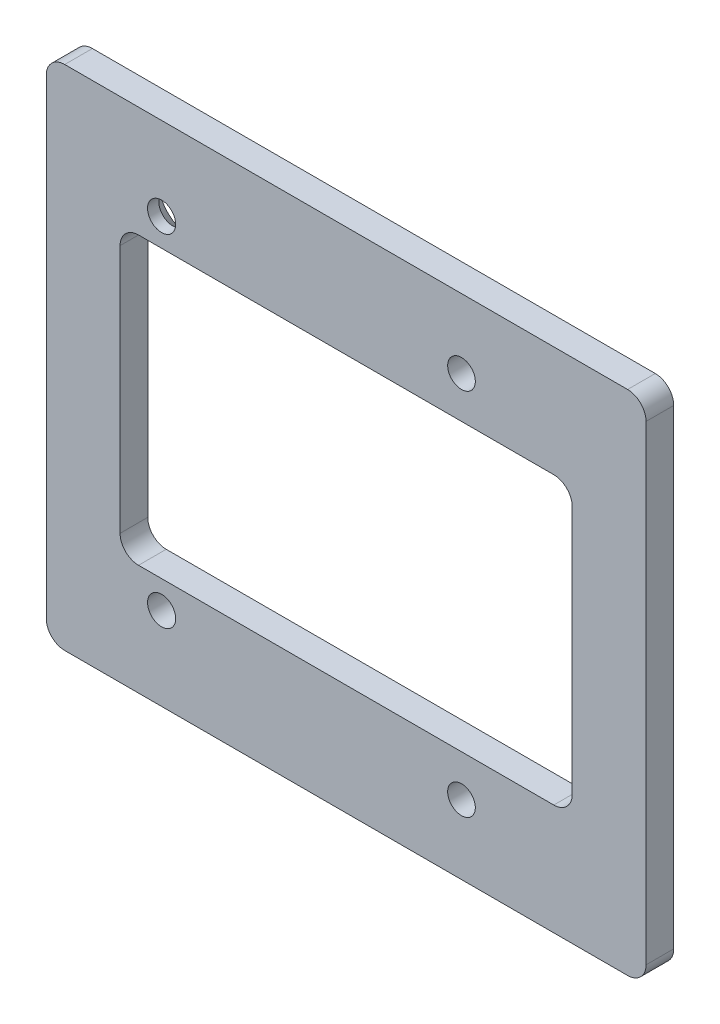
ISO-10303-21;
HEADER;
FILE_DESCRIPTION(('STEP AP214'),'2;1');
FILE_NAME('part.step','',(''),(''),'','','');
FILE_SCHEMA(('AUTOMOTIVE_DESIGN { 1 0 10303 214 1 1 1 1 }'));
ENDSEC;
DATA;
#1=APPLICATION_CONTEXT('core data for automotive mechanical design processes');
#2=APPLICATION_PROTOCOL_DEFINITION('international standard','automotive_design',2000,#1);
#3=PRODUCT_CONTEXT('',#1,'mechanical');
#4=PRODUCT('Part','Part','',(#3));
#5=PRODUCT_RELATED_PRODUCT_CATEGORY('part','',(#4));
#6=PRODUCT_DEFINITION_FORMATION('','',#4);
#7=PRODUCT_DEFINITION_CONTEXT('part definition',#1,'design');
#8=PRODUCT_DEFINITION('design','',#6,#7);
#9=PRODUCT_DEFINITION_SHAPE('','',#8);
#10=(LENGTH_UNIT() NAMED_UNIT(*) SI_UNIT(.MILLI.,.METRE.));
#11=(NAMED_UNIT(*) PLANE_ANGLE_UNIT() SI_UNIT($,.RADIAN.));
#12=(NAMED_UNIT(*) SI_UNIT($,.STERADIAN.) SOLID_ANGLE_UNIT());
#13=UNCERTAINTY_MEASURE_WITH_UNIT(LENGTH_MEASURE(1.E-05),#10,'distance_accuracy_value','');
#14=(GEOMETRIC_REPRESENTATION_CONTEXT(3) GLOBAL_UNCERTAINTY_ASSIGNED_CONTEXT((#13)) GLOBAL_UNIT_ASSIGNED_CONTEXT((#10,
#11,#12)) REPRESENTATION_CONTEXT('',''));
#15=CARTESIAN_POINT('',(0.,0.,0.));
#16=DIRECTION('',(0.,0.,1.));
#17=DIRECTION('',(1.,0.,0.));
#18=AXIS2_PLACEMENT_3D('',#15,#16,#17);
#19=CARTESIAN_POINT('',(32.5,-27.5,3.));
#20=DIRECTION('',(-1.,0.,0.));
#21=DIRECTION('',(0.,0.,1.));
#22=AXIS2_PLACEMENT_3D('',#19,#20,#21);
#23=PLANE('',#22);
#24=DIRECTION('',(0.,1.,0.));
#25=VECTOR('',#24,1.);
#26=CARTESIAN_POINT('',(32.5,-27.5,3.));
#27=LINE('',#26,#25);
#28=CARTESIAN_POINT('',(32.5,-25.5,3.));
#29=VERTEX_POINT('',#28);
#30=CARTESIAN_POINT('',(32.5,25.5,3.));
#31=VERTEX_POINT('',#30);
#32=EDGE_CURVE('E197',#29,#31,#27,.T.);
#33=ORIENTED_EDGE('',*,*,#32,.F.);
#34=DIRECTION('',(0.,0.,-1.));
#35=VECTOR('',#34,1.);
#36=CARTESIAN_POINT('',(32.5,-25.5,3.));
#37=LINE('',#36,#35);
#38=CARTESIAN_POINT('',(32.5,-25.5,0.));
#39=VERTEX_POINT('',#38);
#40=EDGE_CURVE('E222',#29,#39,#37,.T.);
#41=ORIENTED_EDGE('',*,*,#40,.T.);
#42=DIRECTION('',(0.,1.,0.));
#43=VECTOR('',#42,1.);
#44=CARTESIAN_POINT('',(32.5,-27.5,0.));
#45=LINE('',#44,#43);
#46=CARTESIAN_POINT('',(32.5,25.5,0.));
#47=VERTEX_POINT('',#46);
#48=EDGE_CURVE('E196',#39,#47,#45,.T.);
#49=ORIENTED_EDGE('',*,*,#48,.T.);
#50=DIRECTION('',(0.,0.,-1.));
#51=VECTOR('',#50,1.);
#52=CARTESIAN_POINT('',(32.5,25.5,3.));
#53=LINE('',#52,#51);
#54=EDGE_CURVE('E210',#47,#31,#53,.F.);
#55=ORIENTED_EDGE('',*,*,#54,.T.);
#56=EDGE_LOOP('',(#33,#41,#49,#55));
#57=FACE_BOUND('',#56,.T.);
#58=ADVANCED_FACE('F34',(#57),#23,.F.);
#59=CARTESIAN_POINT('',(-32.5,27.5,3.));
#60=DIRECTION('',(0.,-1.,0.));
#61=DIRECTION('',(0.,0.,-1.));
#62=AXIS2_PLACEMENT_3D('',#59,#60,#61);
#63=PLANE('',#62);
#64=DIRECTION('',(-1.,0.,0.));
#65=VECTOR('',#64,1.);
#66=CARTESIAN_POINT('',(-32.5,27.5,0.));
#67=LINE('',#66,#65);
#68=CARTESIAN_POINT('',(30.5,27.5,0.));
#69=VERTEX_POINT('',#68);
#70=CARTESIAN_POINT('',(-30.5,27.5,0.));
#71=VERTEX_POINT('',#70);
#72=EDGE_CURVE('E213',#69,#71,#67,.T.);
#73=ORIENTED_EDGE('',*,*,#72,.T.);
#74=DIRECTION('',(0.,0.,-1.));
#75=VECTOR('',#74,1.);
#76=CARTESIAN_POINT('',(-30.5,27.5,3.));
#77=LINE('',#76,#75);
#78=CARTESIAN_POINT('',(-30.5,27.5,3.));
#79=VERTEX_POINT('',#78);
#80=EDGE_CURVE('E166',#71,#79,#77,.F.);
#81=ORIENTED_EDGE('',*,*,#80,.T.);
#82=DIRECTION('',(-1.,0.,0.));
#83=VECTOR('',#82,1.);
#84=CARTESIAN_POINT('',(-32.5,27.5,3.));
#85=LINE('',#84,#83);
#86=CARTESIAN_POINT('',(30.5,27.5,3.));
#87=VERTEX_POINT('',#86);
#88=EDGE_CURVE('E200',#87,#79,#85,.T.);
#89=ORIENTED_EDGE('',*,*,#88,.F.);
#90=DIRECTION('',(0.,0.,-1.));
#91=VECTOR('',#90,1.);
#92=CARTESIAN_POINT('',(30.5,27.5,3.));
#93=LINE('',#92,#91);
#94=EDGE_CURVE('E251',#87,#69,#93,.T.);
#95=ORIENTED_EDGE('',*,*,#94,.T.);
#96=EDGE_LOOP('',(#73,#81,#89,#95));
#97=FACE_BOUND('',#96,.T.);
#98=ADVANCED_FACE('F290',(#97),#63,.F.);
#99=CARTESIAN_POINT('',(-32.5,-27.5,3.));
#100=DIRECTION('',(1.,0.,0.));
#101=DIRECTION('',(0.,0.,-1.));
#102=AXIS2_PLACEMENT_3D('',#99,#100,#101);
#103=PLANE('',#102);
#104=DIRECTION('',(0.,-1.,0.));
#105=VECTOR('',#104,1.);
#106=CARTESIAN_POINT('',(-32.5,-27.5,0.));
#107=LINE('',#106,#105);
#108=CARTESIAN_POINT('',(-32.5,25.5,0.));
#109=VERTEX_POINT('',#108);
#110=CARTESIAN_POINT('',(-32.5,-25.5,0.));
#111=VERTEX_POINT('',#110);
#112=EDGE_CURVE('E216',#109,#111,#107,.T.);
#113=ORIENTED_EDGE('',*,*,#112,.T.);
#114=DIRECTION('',(0.,0.,-1.));
#115=VECTOR('',#114,1.);
#116=CARTESIAN_POINT('',(-32.5,-25.5,3.));
#117=LINE('',#116,#115);
#118=CARTESIAN_POINT('',(-32.5,-25.5,3.));
#119=VERTEX_POINT('',#118);
#120=EDGE_CURVE('E249',#111,#119,#117,.F.);
#121=ORIENTED_EDGE('',*,*,#120,.T.);
#122=DIRECTION('',(0.,-1.,0.));
#123=VECTOR('',#122,1.);
#124=CARTESIAN_POINT('',(-32.5,-27.5,3.));
#125=LINE('',#124,#123);
#126=CARTESIAN_POINT('',(-32.5,25.5,3.));
#127=VERTEX_POINT('',#126);
#128=EDGE_CURVE('E204',#127,#119,#125,.T.);
#129=ORIENTED_EDGE('',*,*,#128,.F.);
#130=DIRECTION('',(0.,0.,-1.));
#131=VECTOR('',#130,1.);
#132=CARTESIAN_POINT('',(-32.5,25.5,3.));
#133=LINE('',#132,#131);
#134=EDGE_CURVE('E246',#127,#109,#133,.T.);
#135=ORIENTED_EDGE('',*,*,#134,.T.);
#136=EDGE_LOOP('',(#113,#121,#129,#135));
#137=FACE_BOUND('',#136,.T.);
#138=ADVANCED_FACE('F296',(#137),#103,.F.);
#139=CARTESIAN_POINT('',(-32.5,-27.5,3.));
#140=DIRECTION('',(0.,1.,0.));
#141=DIRECTION('',(0.,0.,1.));
#142=AXIS2_PLACEMENT_3D('',#139,#140,#141);
#143=PLANE('',#142);
#144=DIRECTION('',(1.,0.,0.));
#145=VECTOR('',#144,1.);
#146=CARTESIAN_POINT('',(-32.5,-27.5,0.));
#147=LINE('',#146,#145);
#148=CARTESIAN_POINT('',(-30.5,-27.5,0.));
#149=VERTEX_POINT('',#148);
#150=CARTESIAN_POINT('',(30.5,-27.5,0.));
#151=VERTEX_POINT('',#150);
#152=EDGE_CURVE('E201',#149,#151,#147,.T.);
#153=ORIENTED_EDGE('',*,*,#152,.T.);
#154=DIRECTION('',(0.,0.,-1.));
#155=VECTOR('',#154,1.);
#156=CARTESIAN_POINT('',(30.5,-27.5,3.));
#157=LINE('',#156,#155);
#158=CARTESIAN_POINT('',(30.5,-27.5,3.));
#159=VERTEX_POINT('',#158);
#160=EDGE_CURVE('E236',#151,#159,#157,.F.);
#161=ORIENTED_EDGE('',*,*,#160,.T.);
#162=DIRECTION('',(1.,0.,0.));
#163=VECTOR('',#162,1.);
#164=CARTESIAN_POINT('',(-32.5,-27.5,3.));
#165=LINE('',#164,#163);
#166=CARTESIAN_POINT('',(-30.5,-27.5,3.));
#167=VERTEX_POINT('',#166);
#168=EDGE_CURVE('E207',#167,#159,#165,.T.);
#169=ORIENTED_EDGE('',*,*,#168,.F.);
#170=DIRECTION('',(0.,0.,-1.));
#171=VECTOR('',#170,1.);
#172=CARTESIAN_POINT('',(-30.5,-27.5,3.));
#173=LINE('',#172,#171);
#174=EDGE_CURVE('E233',#167,#149,#173,.T.);
#175=ORIENTED_EDGE('',*,*,#174,.T.);
#176=EDGE_LOOP('',(#153,#161,#169,#175));
#177=FACE_BOUND('',#176,.T.);
#178=ADVANCED_FACE('F398',(#177),#143,.F.);
#179=CARTESIAN_POINT('',(0.,0.,3.));
#180=DIRECTION('',(0.,0.,-1.));
#181=DIRECTION('',(-1.,0.,0.));
#182=AXIS2_PLACEMENT_3D('',#179,#180,#181);
#183=PLANE('',#182);
#184=DIRECTION('',(0.,-1.,0.));
#185=VECTOR('',#184,1.);
#186=CARTESIAN_POINT('',(24.5,0.,3.));
#187=LINE('',#186,#185);
#188=CARTESIAN_POINT('',(24.5,13.5,3.));
#189=VERTEX_POINT('',#188);
#190=CARTESIAN_POINT('',(24.5,-13.5,3.));
#191=VERTEX_POINT('',#190);
#192=EDGE_CURVE('E387',#189,#191,#187,.T.);
#193=ORIENTED_EDGE('',*,*,#192,.T.);
#194=CARTESIAN_POINT('',(22.5,-13.5,3.));
#195=DIRECTION('',(0.,0.,-1.));
#196=DIRECTION('',(-1.,0.,0.));
#197=AXIS2_PLACEMENT_3D('',#194,#195,#196);
#198=CIRCLE('',#197,2.);
#199=CARTESIAN_POINT('',(22.5,-15.5,3.));
#200=VERTEX_POINT('',#199);
#201=EDGE_CURVE('E334',#191,#200,#198,.T.);
#202=ORIENTED_EDGE('',*,*,#201,.T.);
#203=DIRECTION('',(-1.,0.,0.));
#204=VECTOR('',#203,1.);
#205=CARTESIAN_POINT('',(0.,-15.5,3.));
#206=LINE('',#205,#204);
#207=CARTESIAN_POINT('',(-22.5,-15.5,3.));
#208=VERTEX_POINT('',#207);
#209=EDGE_CURVE('E375',#200,#208,#206,.T.);
#210=ORIENTED_EDGE('',*,*,#209,.T.);
#211=CARTESIAN_POINT('',(-22.5,-13.5,3.));
#212=DIRECTION('',(0.,0.,-1.));
#213=DIRECTION('',(-1.,0.,0.));
#214=AXIS2_PLACEMENT_3D('',#211,#212,#213);
#215=CIRCLE('',#214,2.);
#216=CARTESIAN_POINT('',(-24.5,-13.5,3.));
#217=VERTEX_POINT('',#216);
#218=EDGE_CURVE('E347',#208,#217,#215,.T.);
#219=ORIENTED_EDGE('',*,*,#218,.T.);
#220=DIRECTION('',(0.,1.,0.));
#221=VECTOR('',#220,1.);
#222=CARTESIAN_POINT('',(-24.5,0.,3.));
#223=LINE('',#222,#221);
#224=CARTESIAN_POINT('',(-24.5,13.5,3.));
#225=VERTEX_POINT('',#224);
#226=EDGE_CURVE('E369',#217,#225,#223,.T.);
#227=ORIENTED_EDGE('',*,*,#226,.T.);
#228=CARTESIAN_POINT('',(-22.5,13.5,3.));
#229=DIRECTION('',(0.,0.,-1.));
#230=DIRECTION('',(-1.,0.,0.));
#231=AXIS2_PLACEMENT_3D('',#228,#229,#230);
#232=CIRCLE('',#231,2.);
#233=CARTESIAN_POINT('',(-22.5,15.5,3.));
#234=VERTEX_POINT('',#233);
#235=EDGE_CURVE('E341',#225,#234,#232,.T.);
#236=ORIENTED_EDGE('',*,*,#235,.T.);
#237=DIRECTION('',(1.,0.,0.));
#238=VECTOR('',#237,1.);
#239=CARTESIAN_POINT('',(0.,15.5,3.));
#240=LINE('',#239,#238);
#241=CARTESIAN_POINT('',(22.5,15.5,3.));
#242=VERTEX_POINT('',#241);
#243=EDGE_CURVE('E378',#234,#242,#240,.T.);
#244=ORIENTED_EDGE('',*,*,#243,.T.);
#245=CARTESIAN_POINT('',(22.5,13.5,3.));
#246=DIRECTION('',(0.,0.,-1.));
#247=DIRECTION('',(-1.,0.,0.));
#248=AXIS2_PLACEMENT_3D('',#245,#246,#247);
#249=CIRCLE('',#248,2.);
#250=EDGE_CURVE('E11',#242,#189,#249,.T.);
#251=ORIENTED_EDGE('',*,*,#250,.T.);
#252=EDGE_LOOP('',(#193,#202,#210,#219,#227,#236,#244,#251));
#253=FACE_BOUND('',#252,.T.);
#254=CARTESIAN_POINT('',(12.5,20.,3.));
#255=DIRECTION('',(0.,0.,-1.));
#256=DIRECTION('',(-1.,0.,0.));
#257=AXIS2_PLACEMENT_3D('',#254,#255,#256);
#258=CIRCLE('',#257,1.49999999999999);
#259=CARTESIAN_POINT('',(11.,20.,3.));
#260=VERTEX_POINT('',#259);
#261=EDGE_CURVE('E178',#260,#260,#258,.T.);
#262=ORIENTED_EDGE('',*,*,#261,.T.);
#263=EDGE_LOOP('',(#262));
#264=FACE_BOUND('',#263,.T.);
#265=CARTESIAN_POINT('',(12.5,-20.,3.));
#266=DIRECTION('',(0.,0.,-1.));
#267=DIRECTION('',(-1.,0.,0.));
#268=AXIS2_PLACEMENT_3D('',#265,#266,#267);
#269=CIRCLE('',#268,1.49999999999999);
#270=CARTESIAN_POINT('',(11.0000000000001,-20.,3.));
#271=VERTEX_POINT('',#270);
#272=EDGE_CURVE('E184',#271,#271,#269,.T.);
#273=ORIENTED_EDGE('',*,*,#272,.T.);
#274=EDGE_LOOP('',(#273));
#275=FACE_BOUND('',#274,.T.);
#276=CARTESIAN_POINT('',(-20.,-18.5,3.));
#277=DIRECTION('',(0.,0.,-1.));
#278=DIRECTION('',(-1.,0.,0.));
#279=AXIS2_PLACEMENT_3D('',#276,#277,#278);
#280=CIRCLE('',#279,1.525);
#281=CARTESIAN_POINT('',(-21.525,-18.5,3.));
#282=VERTEX_POINT('',#281);
#283=EDGE_CURVE('E193',#282,#282,#280,.T.);
#284=ORIENTED_EDGE('',*,*,#283,.T.);
#285=EDGE_LOOP('',(#284));
#286=FACE_BOUND('',#285,.T.);
#287=CARTESIAN_POINT('',(-20.,18.5,3.));
#288=DIRECTION('',(0.,0.,-1.));
#289=DIRECTION('',(-1.,0.,0.));
#290=AXIS2_PLACEMENT_3D('',#287,#288,#289);
#291=CIRCLE('',#290,1.525);
#292=CARTESIAN_POINT('',(-21.525,18.5,3.));
#293=VERTEX_POINT('',#292);
#294=EDGE_CURVE('E190',#293,#293,#291,.T.);
#295=ORIENTED_EDGE('',*,*,#294,.T.);
#296=EDGE_LOOP('',(#295));
#297=FACE_BOUND('',#296,.T.);
#298=ORIENTED_EDGE('',*,*,#168,.T.);
#299=CARTESIAN_POINT('',(30.5,-25.5,3.));
#300=DIRECTION('',(0.,0.,-1.));
#301=DIRECTION('',(-1.,0.,0.));
#302=AXIS2_PLACEMENT_3D('',#299,#300,#301);
#303=CIRCLE('',#302,2.);
#304=EDGE_CURVE('E244',#159,#29,#303,.F.);
#305=ORIENTED_EDGE('',*,*,#304,.T.);
#306=ORIENTED_EDGE('',*,*,#32,.T.);
#307=CARTESIAN_POINT('',(30.5,25.5,3.));
#308=DIRECTION('',(0.,0.,-1.));
#309=DIRECTION('',(-1.,0.,0.));
#310=AXIS2_PLACEMENT_3D('',#307,#308,#309);
#311=CIRCLE('',#310,2.);
#312=EDGE_CURVE('E238',#31,#87,#311,.F.);
#313=ORIENTED_EDGE('',*,*,#312,.T.);
#314=ORIENTED_EDGE('',*,*,#88,.T.);
#315=CARTESIAN_POINT('',(-30.5,25.5,3.));
#316=DIRECTION('',(0.,0.,-1.));
#317=DIRECTION('',(-1.,0.,0.));
#318=AXIS2_PLACEMENT_3D('',#315,#316,#317);
#319=CIRCLE('',#318,2.);
#320=EDGE_CURVE('E240',#79,#127,#319,.F.);
#321=ORIENTED_EDGE('',*,*,#320,.T.);
#322=ORIENTED_EDGE('',*,*,#128,.T.);
#323=CARTESIAN_POINT('',(-30.5,-25.5,3.));
#324=DIRECTION('',(0.,0.,-1.));
#325=DIRECTION('',(-1.,0.,0.));
#326=AXIS2_PLACEMENT_3D('',#323,#324,#325);
#327=CIRCLE('',#326,2.);
#328=EDGE_CURVE('E242',#119,#167,#327,.F.);
#329=ORIENTED_EDGE('',*,*,#328,.T.);
#330=EDGE_LOOP('',(#298,#305,#306,#313,#314,#321,#322,#329));
#331=FACE_BOUND('',#330,.T.);
#332=ADVANCED_FACE('F371',(#253,#264,#275,#286,#297,#331),#183,.F.);
#333=CARTESIAN_POINT('',(0.,0.,0.));
#334=DIRECTION('',(0.,0.,-1.));
#335=DIRECTION('',(-1.,0.,0.));
#336=AXIS2_PLACEMENT_3D('',#333,#334,#335);
#337=PLANE('',#336);
#338=DIRECTION('',(1.,0.,0.));
#339=VECTOR('',#338,1.);
#340=CARTESIAN_POINT('',(24.5,15.5,0.));
#341=LINE('',#340,#339);
#342=CARTESIAN_POINT('',(-22.5,15.5,0.));
#343=VERTEX_POINT('',#342);
#344=CARTESIAN_POINT('',(-21.3747727084867,15.5,0.));
#345=VERTEX_POINT('',#344);
#346=EDGE_CURVE('E161',#343,#345,#341,.T.);
#347=ORIENTED_EDGE('',*,*,#346,.F.);
#348=CARTESIAN_POINT('',(-22.5,13.5,0.));
#349=DIRECTION('',(0.,0.,-1.));
#350=DIRECTION('',(-1.,0.,0.));
#351=AXIS2_PLACEMENT_3D('',#348,#349,#350);
#352=CIRCLE('',#351,2.);
#353=CARTESIAN_POINT('',(-24.5,13.5,0.));
#354=VERTEX_POINT('',#353);
#355=EDGE_CURVE('E345',#343,#354,#352,.F.);
#356=ORIENTED_EDGE('',*,*,#355,.T.);
#357=DIRECTION('',(0.,1.,0.));
#358=VECTOR('',#357,1.);
#359=CARTESIAN_POINT('',(-24.5,-15.5,0.));
#360=LINE('',#359,#358);
#361=CARTESIAN_POINT('',(-24.5,-13.5,0.));
#362=VERTEX_POINT('',#361);
#363=EDGE_CURVE('E173',#362,#354,#360,.T.);
#364=ORIENTED_EDGE('',*,*,#363,.F.);
#365=CARTESIAN_POINT('',(-22.5,-13.5,0.));
#366=DIRECTION('',(0.,0.,-1.));
#367=DIRECTION('',(-1.,0.,0.));
#368=AXIS2_PLACEMENT_3D('',#365,#366,#367);
#369=CIRCLE('',#368,2.);
#370=CARTESIAN_POINT('',(-22.5,-15.5,0.));
#371=VERTEX_POINT('',#370);
#372=EDGE_CURVE('E349',#362,#371,#369,.F.);
#373=ORIENTED_EDGE('',*,*,#372,.T.);
#374=DIRECTION('',(-1.,0.,0.));
#375=VECTOR('',#374,1.);
#376=CARTESIAN_POINT('',(24.5,-15.5,0.));
#377=LINE('',#376,#375);
#378=CARTESIAN_POINT('',(22.5,-15.5,0.));
#379=VERTEX_POINT('',#378);
#380=EDGE_CURVE('E380',#379,#371,#377,.T.);
#381=ORIENTED_EDGE('',*,*,#380,.F.);
#382=CARTESIAN_POINT('',(22.5,-13.5,0.));
#383=DIRECTION('',(0.,0.,-1.));
#384=DIRECTION('',(-1.,0.,0.));
#385=AXIS2_PLACEMENT_3D('',#382,#383,#384);
#386=CIRCLE('',#385,2.);
#387=CARTESIAN_POINT('',(24.5,-13.5,0.));
#388=VERTEX_POINT('',#387);
#389=EDGE_CURVE('E339',#379,#388,#386,.F.);
#390=ORIENTED_EDGE('',*,*,#389,.T.);
#391=DIRECTION('',(0.,-1.,0.));
#392=VECTOR('',#391,1.);
#393=CARTESIAN_POINT('',(24.5,-15.5,0.));
#394=LINE('',#393,#392);
#395=CARTESIAN_POINT('',(24.5,13.5,0.));
#396=VERTEX_POINT('',#395);
#397=EDGE_CURVE('E379',#396,#388,#394,.T.);
#398=ORIENTED_EDGE('',*,*,#397,.F.);
#399=CARTESIAN_POINT('',(22.5,13.5,0.));
#400=DIRECTION('',(0.,0.,-1.));
#401=DIRECTION('',(-1.,0.,0.));
#402=AXIS2_PLACEMENT_3D('',#399,#400,#401);
#403=CIRCLE('',#402,2.);
#404=CARTESIAN_POINT('',(22.5,15.5,0.));
#405=VERTEX_POINT('',#404);
#406=EDGE_CURVE('E42',#396,#405,#403,.F.);
#407=ORIENTED_EDGE('',*,*,#406,.T.);
#408=CARTESIAN_POINT('',(-18.6252272915133,15.5,0.));
#409=VERTEX_POINT('',#408);
#410=EDGE_CURVE('E157',#409,#405,#341,.T.);
#411=ORIENTED_EDGE('',*,*,#410,.F.);
#412=CARTESIAN_POINT('',(-20.,18.5,0.));
#413=DIRECTION('',(0.,0.,-1.));
#414=DIRECTION('',(-1.,0.,0.));
#415=AXIS2_PLACEMENT_3D('',#412,#413,#414);
#416=CIRCLE('',#415,3.3);
#417=EDGE_CURVE('E171',#345,#409,#416,.T.);
#418=ORIENTED_EDGE('',*,*,#417,.F.);
#419=EDGE_LOOP('',(#347,#356,#364,#373,#381,#390,#398,#407,#411,#418));
#420=FACE_BOUND('',#419,.T.);
#421=CARTESIAN_POINT('',(12.5,20.,0.));
#422=DIRECTION('',(0.,0.,-1.));
#423=DIRECTION('',(-1.,0.,0.));
#424=AXIS2_PLACEMENT_3D('',#421,#422,#423);
#425=CIRCLE('',#424,1.49999999999999);
#426=CARTESIAN_POINT('',(11.,20.,0.));
#427=VERTEX_POINT('',#426);
#428=EDGE_CURVE('E390',#427,#427,#425,.T.);
#429=ORIENTED_EDGE('',*,*,#428,.F.);
#430=EDGE_LOOP('',(#429));
#431=FACE_BOUND('',#430,.T.);
#432=CARTESIAN_POINT('',(12.5,-20.,0.));
#433=DIRECTION('',(0.,0.,-1.));
#434=DIRECTION('',(-1.,0.,0.));
#435=AXIS2_PLACEMENT_3D('',#432,#433,#434);
#436=CIRCLE('',#435,1.49999999999999);
#437=CARTESIAN_POINT('',(11.0000000000001,-20.,0.));
#438=VERTEX_POINT('',#437);
#439=EDGE_CURVE('E374',#438,#438,#436,.T.);
#440=ORIENTED_EDGE('',*,*,#439,.F.);
#441=EDGE_LOOP('',(#440));
#442=FACE_BOUND('',#441,.T.);
#443=CARTESIAN_POINT('',(-20.,-18.5,0.));
#444=DIRECTION('',(0.,0.,-1.));
#445=DIRECTION('',(-1.,0.,0.));
#446=AXIS2_PLACEMENT_3D('',#443,#444,#445);
#447=CIRCLE('',#446,1.525);
#448=CARTESIAN_POINT('',(-21.525,-18.5,0.));
#449=VERTEX_POINT('',#448);
#450=EDGE_CURVE('E181',#449,#449,#447,.T.);
#451=ORIENTED_EDGE('',*,*,#450,.F.);
#452=EDGE_LOOP('',(#451));
#453=FACE_BOUND('',#452,.T.);
#454=ORIENTED_EDGE('',*,*,#48,.F.);
#455=CARTESIAN_POINT('',(30.5,-25.5,0.));
#456=DIRECTION('',(0.,0.,-1.));
#457=DIRECTION('',(-1.,0.,0.));
#458=AXIS2_PLACEMENT_3D('',#455,#456,#457);
#459=CIRCLE('',#458,2.);
#460=EDGE_CURVE('E231',#39,#151,#459,.T.);
#461=ORIENTED_EDGE('',*,*,#460,.T.);
#462=ORIENTED_EDGE('',*,*,#152,.F.);
#463=CARTESIAN_POINT('',(-30.5,-25.5,0.));
#464=DIRECTION('',(0.,0.,-1.));
#465=DIRECTION('',(-1.,0.,0.));
#466=AXIS2_PLACEMENT_3D('',#463,#464,#465);
#467=CIRCLE('',#466,2.);
#468=EDGE_CURVE('E229',#149,#111,#467,.T.);
#469=ORIENTED_EDGE('',*,*,#468,.T.);
#470=ORIENTED_EDGE('',*,*,#112,.F.);
#471=CARTESIAN_POINT('',(-30.5,25.5,0.));
#472=DIRECTION('',(0.,0.,-1.));
#473=DIRECTION('',(-1.,0.,0.));
#474=AXIS2_PLACEMENT_3D('',#471,#472,#473);
#475=CIRCLE('',#474,2.);
#476=EDGE_CURVE('E227',#109,#71,#475,.T.);
#477=ORIENTED_EDGE('',*,*,#476,.T.);
#478=ORIENTED_EDGE('',*,*,#72,.F.);
#479=CARTESIAN_POINT('',(30.5,25.5,0.));
#480=DIRECTION('',(0.,0.,-1.));
#481=DIRECTION('',(-1.,0.,0.));
#482=AXIS2_PLACEMENT_3D('',#479,#480,#481);
#483=CIRCLE('',#482,2.);
#484=EDGE_CURVE('E225',#69,#47,#483,.T.);
#485=ORIENTED_EDGE('',*,*,#484,.T.);
#486=EDGE_LOOP('',(#454,#461,#462,#469,#470,#477,#478,#485));
#487=FACE_BOUND('',#486,.T.);
#488=ADVANCED_FACE('F169',(#420,#431,#442,#453,#487),#337,.T.);
#489=CARTESIAN_POINT('',(30.5,-25.5,3.));
#490=DIRECTION('',(0.,0.,-1.));
#491=DIRECTION('',(-1.,0.,0.));
#492=AXIS2_PLACEMENT_3D('',#489,#490,#491);
#493=CYLINDRICAL_SURFACE('',#492,2.);
#494=ORIENTED_EDGE('',*,*,#304,.F.);
#495=ORIENTED_EDGE('',*,*,#160,.F.);
#496=ORIENTED_EDGE('',*,*,#460,.F.);
#497=ORIENTED_EDGE('',*,*,#40,.F.);
#498=EDGE_LOOP('',(#494,#495,#496,#497));
#499=FACE_BOUND('',#498,.T.);
#500=ADVANCED_FACE('F302',(#499),#493,.T.);
#501=CARTESIAN_POINT('',(-30.5,-25.5,3.));
#502=DIRECTION('',(0.,0.,-1.));
#503=DIRECTION('',(-1.,0.,0.));
#504=AXIS2_PLACEMENT_3D('',#501,#502,#503);
#505=CYLINDRICAL_SURFACE('',#504,2.);
#506=ORIENTED_EDGE('',*,*,#328,.F.);
#507=ORIENTED_EDGE('',*,*,#120,.F.);
#508=ORIENTED_EDGE('',*,*,#468,.F.);
#509=ORIENTED_EDGE('',*,*,#174,.F.);
#510=EDGE_LOOP('',(#506,#507,#508,#509));
#511=FACE_BOUND('',#510,.T.);
#512=ADVANCED_FACE('F305',(#511),#505,.T.);
#513=CARTESIAN_POINT('',(-30.5,25.5,3.));
#514=DIRECTION('',(0.,0.,-1.));
#515=DIRECTION('',(-1.,0.,0.));
#516=AXIS2_PLACEMENT_3D('',#513,#514,#515);
#517=CYLINDRICAL_SURFACE('',#516,2.);
#518=ORIENTED_EDGE('',*,*,#320,.F.);
#519=ORIENTED_EDGE('',*,*,#80,.F.);
#520=ORIENTED_EDGE('',*,*,#476,.F.);
#521=ORIENTED_EDGE('',*,*,#134,.F.);
#522=EDGE_LOOP('',(#518,#519,#520,#521));
#523=FACE_BOUND('',#522,.T.);
#524=ADVANCED_FACE('F309',(#523),#517,.T.);
#525=CARTESIAN_POINT('',(30.5,25.5,3.));
#526=DIRECTION('',(0.,0.,-1.));
#527=DIRECTION('',(-1.,0.,0.));
#528=AXIS2_PLACEMENT_3D('',#525,#526,#527);
#529=CYLINDRICAL_SURFACE('',#528,2.);
#530=ORIENTED_EDGE('',*,*,#312,.F.);
#531=ORIENTED_EDGE('',*,*,#54,.F.);
#532=ORIENTED_EDGE('',*,*,#484,.F.);
#533=ORIENTED_EDGE('',*,*,#94,.F.);
#534=EDGE_LOOP('',(#530,#531,#532,#533));
#535=FACE_BOUND('',#534,.T.);
#536=ADVANCED_FACE('F313',(#535),#529,.T.);
#537=CARTESIAN_POINT('',(-20.,18.5,6.));
#538=DIRECTION('',(0.,0.,-1.));
#539=DIRECTION('',(-1.,0.,0.));
#540=AXIS2_PLACEMENT_3D('',#537,#538,#539);
#541=CYLINDRICAL_SURFACE('',#540,1.525);
#542=CARTESIAN_POINT('',(-20.,18.5,1.775));
#543=DIRECTION('',(0.,0.,-1.));
#544=DIRECTION('',(-1.,0.,0.));
#545=AXIS2_PLACEMENT_3D('',#542,#543,#544);
#546=CIRCLE('',#545,1.525);
#547=CARTESIAN_POINT('',(-21.525,18.5,1.775));
#548=VERTEX_POINT('',#547);
#549=EDGE_CURVE('E177',#548,#548,#546,.T.);
#550=ORIENTED_EDGE('',*,*,#549,.T.);
#551=EDGE_LOOP('',(#550));
#552=FACE_BOUND('',#551,.T.);
#553=ORIENTED_EDGE('',*,*,#294,.F.);
#554=EDGE_LOOP('',(#553));
#555=FACE_BOUND('',#554,.T.);
#556=ADVANCED_FACE('F317',(#552,#555),#541,.F.);
#557=CARTESIAN_POINT('',(-20.,-18.5,6.));
#558=DIRECTION('',(0.,0.,-1.));
#559=DIRECTION('',(-1.,0.,0.));
#560=AXIS2_PLACEMENT_3D('',#557,#558,#559);
#561=CYLINDRICAL_SURFACE('',#560,1.525);
#562=ORIENTED_EDGE('',*,*,#450,.T.);
#563=EDGE_LOOP('',(#562));
#564=FACE_BOUND('',#563,.T.);
#565=ORIENTED_EDGE('',*,*,#283,.F.);
#566=EDGE_LOOP('',(#565));
#567=FACE_BOUND('',#566,.T.);
#568=ADVANCED_FACE('F286',(#564,#567),#561,.F.);
#569=CARTESIAN_POINT('',(-20.,18.5,0.));
#570=DIRECTION('',(0.,0.,-1.));
#571=DIRECTION('',(-1.,0.,0.));
#572=AXIS2_PLACEMENT_3D('',#569,#570,#571);
#573=CONICAL_SURFACE('',#572,3.3,0.785398163397449);
#574=ORIENTED_EDGE('',*,*,#417,.T.);
#575=CARTESIAN_POINT('',(-10.3194787230001,15.5,-6.83471717387556));
#576=CARTESIAN_POINT('',(-10.4949108736432,15.5,-6.66715123843977));
#577=CARTESIAN_POINT('',(-10.6705381741531,15.5,-6.49978938595393));
#578=CARTESIAN_POINT('',(-11.022261845132,15.5,-6.16555699383829));
#579=CARTESIAN_POINT('',(-11.1983582187662,15.5,-5.99868645753974));
#580=CARTESIAN_POINT('',(-11.7275602305781,15.5,-5.4988505089995));
#581=CARTESIAN_POINT('',(-12.0814846577306,15.5,-5.16675080982777));
#582=CARTESIAN_POINT('',(-12.7951381984158,15.5,-4.503360832503));
#583=CARTESIAN_POINT('',(-13.1548909875783,15.5,-4.17209592528326));
#584=CARTESIAN_POINT('',(-13.6980693209057,15.5,-3.67915675319924));
#585=CARTESIAN_POINT('',(-13.8797077194674,15.5,-3.5155144741468));
#586=CARTESIAN_POINT('',(-14.2444927704541,15.5,-3.18992103182755));
#587=CARTESIAN_POINT('',(-14.4276394063115,15.5,-3.02796985002862));
#588=CARTESIAN_POINT('',(-14.8289231652756,15.5,-2.67736158688809));
#589=CARTESIAN_POINT('',(-15.0474357376805,15.5,-2.48913331111925));
#590=CARTESIAN_POINT('',(-15.4881432927272,15.5,-2.11690364403376));
#591=CARTESIAN_POINT('',(-15.7103391078738,15.5,-1.93290323137746));
#592=CARTESIAN_POINT('',(-16.0472761364194,15.5,-1.6618178715019));
#593=CARTESIAN_POINT('',(-16.1600983316761,15.5,-1.57234920287835));
#594=CARTESIAN_POINT('',(-16.3872790739836,15.5,-1.39538739123998));
#595=CARTESIAN_POINT('',(-16.5016375633145,15.5,-1.30789417433515));
#596=CARTESIAN_POINT('',(-16.7321691949528,15.5,-1.1354111386296));
#597=CARTESIAN_POINT('',(-16.8483416778225,15.5,-1.05042044108811));
#598=CARTESIAN_POINT('',(-17.0829271103207,15.5,-0.883599626953957));
#599=CARTESIAN_POINT('',(-17.2013398267195,15.5,-0.801769184017011));
#600=CARTESIAN_POINT('',(-17.4262420071645,15.5,-0.651972553352321));
#601=CARTESIAN_POINT('',(-17.5324164427653,15.5,-0.583535490759273));
#602=CARTESIAN_POINT('',(-17.7472791211469,15.5,-0.450681821224408));
#603=CARTESIAN_POINT('',(-17.8559676291977,15.5,-0.38626564121911));
#604=CARTESIAN_POINT('',(-18.0763852043736,15.5,-0.26257933395494));
#605=CARTESIAN_POINT('',(-18.1881165785168,15.5,-0.203313262564371));
#606=CARTESIAN_POINT('',(-18.4148857056755,15.5,-0.0915829284654322));
#607=CARTESIAN_POINT('',(-18.5299227425077,15.5,-0.0391172058107689));
#608=CARTESIAN_POINT('',(-18.8294477323369,15.5,0.0840115770176625));
#609=CARTESIAN_POINT('',(-19.016707425187,15.5,0.148381067013609));
#610=CARTESIAN_POINT('',(-19.3031365500214,15.5,0.221504438681832));
#611=CARTESIAN_POINT('',(-19.3993452358867,15.5,0.241956720093729));
#612=CARTESIAN_POINT('',(-19.5932452534713,15.5,0.27405824392628));
#613=CARTESIAN_POINT('',(-19.6909363989109,15.5,0.285708583171037));
#614=CARTESIAN_POINT('',(-19.8879677750789,15.5,0.299532830291698));
#615=CARTESIAN_POINT('',(-19.9873147643429,15.5,0.301612030332729));
#616=CARTESIAN_POINT('',(-20.1857189463642,15.5,0.295893432812402));
#617=CARTESIAN_POINT('',(-20.284776137513,15.5,0.28809558052961));
#618=CARTESIAN_POINT('',(-20.4819913886889,15.5,0.263108481916593));
#619=CARTESIAN_POINT('',(-20.5801456837937,15.5,0.245890038854651));
#620=CARTESIAN_POINT('',(-20.7745972782554,15.5,0.203067083204));
#621=CARTESIAN_POINT('',(-20.8708941026691,15.5,0.177460455136141));
#622=CARTESIAN_POINT('',(-21.1082571366857,15.5,0.10470501075108));
#623=CARTESIAN_POINT('',(-21.2479693872802,15.5,0.0531610720594437));
#624=CARTESIAN_POINT('',(-21.5223749118807,15.5,-0.0618528842231252));
#625=CARTESIAN_POINT('',(-21.6570645317513,15.5,-0.125331389307288));
#626=CARTESIAN_POINT('',(-21.8564422015837,15.5,-0.227476267366908));
#627=CARTESIAN_POINT('',(-21.9228267530606,15.5,-0.262899684581921));
#628=CARTESIAN_POINT('',(-22.0545359946282,15.5,-0.335670619730158));
#629=CARTESIAN_POINT('',(-22.1198606693995,15.5,-0.373018165442445));
#630=CARTESIAN_POINT('',(-22.2495110249371,15.5,-0.449340556897633));
#631=CARTESIAN_POINT('',(-22.313837119375,15.5,-0.488314702712257));
#632=CARTESIAN_POINT('',(-22.4416033194056,15.5,-0.567677314145471));
#633=CARTESIAN_POINT('',(-22.505043476291,15.5,-0.6080656974057));
#634=CARTESIAN_POINT('',(-22.743953818028,15.5,-0.763416159632535));
#635=CARTESIAN_POINT('',(-22.9167513418018,15.5,-0.882494573571515));
#636=CARTESIAN_POINT('',(-23.2577615263037,15.5,-1.12707040792684));
#637=CARTESIAN_POINT('',(-23.4259726347801,15.5,-1.25256996120709));
#638=CARTESIAN_POINT('',(-23.7590567362559,15.5,-1.50823380092752));
#639=CARTESIAN_POINT('',(-23.9239263576991,15.5,-1.6384024642774));
#640=CARTESIAN_POINT('',(-24.2509842039214,15.5,-1.90206905767856));
#641=CARTESIAN_POINT('',(-24.4131722777666,15.5,-2.03556717407804));
#642=CARTESIAN_POINT('',(-24.736097752875,15.5,-2.30560013076129));
#643=CARTESIAN_POINT('',(-24.8968267729278,15.5,-2.44214497014921));
#644=CARTESIAN_POINT('',(-25.216615844386,15.5,-2.71717990736718));
#645=CARTESIAN_POINT('',(-25.3756758487227,15.5,-2.85567005980164));
#646=CARTESIAN_POINT('',(-25.850671328269,15.5,-3.27323476921376));
#647=CARTESIAN_POINT('',(-26.1646185147051,15.5,-3.5545695747909));
#648=CARTESIAN_POINT('',(-26.7485457612693,15.5,-4.08444281691335));
#649=CARTESIAN_POINT('',(-27.0189550746214,15.5,-4.33251084664987));
#650=CARTESIAN_POINT('',(-27.5578397877589,15.5,-4.83083107199018));
#651=CARTESIAN_POINT('',(-27.8263148444495,15.5,-5.08108363847994));
#652=CARTESIAN_POINT('',(-28.3597397263345,15.5,-5.5812557837574));
#653=CARTESIAN_POINT('',(-28.624700823726,15.5,-5.83116336163112));
#654=CARTESIAN_POINT('',(-29.1534208832563,15.5,-6.33214155321996));
#655=CARTESIAN_POINT('',(-29.4171800757945,15.5,-6.58321192367394));
#656=CARTESIAN_POINT('',(-29.6805212769999,15.5,-6.83471717387556));
#657=B_SPLINE_CURVE_WITH_KNOTS('',3,(#575,#576,#577,#578,#579,#580,#581,#582,#583,#584,#585,
#586,#587,#588,#589,#590,#591,#592,#593,#594,#595,#596,#597,#598,#599,#600,#601,#602,#603,#604,
#605,#606,#607,#608,#609,#610,#611,#612,#613,#614,#615,#616,#617,#618,#619,#620,#621,#622,#623,
#624,#625,#626,#627,#628,#629,#630,#631,#632,#633,#634,#635,#636,#637,#638,#639,#640,#641,#642,
#643,#644,#645,#646,#647,#648,#649,#650,#651,#652,#653,#654,#655,#656),.UNSPECIFIED.,.F.,.F.,(4,
2,2,2,2,2,2,2,2,2,2,2,2,2,2,2,2,2,2,2,2,2,2,2,2,2,2,2,2,2,2,2,2,2,2,2,2,2,2,2,4),(0.,
0.727800116629831,1.45560515659176,2.91160597495906,4.37868165693952,5.11211896747475,
5.84554823208107,6.71073079875858,7.57611165932356,8.00806896154701,8.44001007993698,
8.87179767154329,9.30354055464317,9.68242789810403,10.0613554035539,10.4405786715326,
10.8197203898876,11.4114693329026,11.7062084893459,12.0009109118105,12.2985232773509,
12.5961372917482,12.8946789536736,13.1932959650953,13.6392525820897,14.0855275575436,
14.3112354975141,14.5369466969928,14.7625617542776,14.9881636946107,15.6174711502183,
16.2469890128725,16.8771132657702,17.5072728659791,18.1399493222563,18.7726435732163,
20.0372611199468,21.1381270577248,22.2391836812492,23.3318478765006,24.4242929700059),.UNSPECIFIED.);
#658=EDGE_CURVE('E153',#409,#345,#657,.T.);
#659=ORIENTED_EDGE('',*,*,#658,.T.);
#660=EDGE_LOOP('',(#574,#659));
#661=FACE_BOUND('',#660,.T.);
#662=ORIENTED_EDGE('',*,*,#549,.F.);
#663=EDGE_LOOP('',(#662));
#664=FACE_BOUND('',#663,.T.);
#665=ADVANCED_FACE('F175',(#661,#664),#573,.F.);
#666=CARTESIAN_POINT('',(12.5,-20.,10.));
#667=DIRECTION('',(0.,0.,-1.));
#668=DIRECTION('',(-1.,0.,0.));
#669=AXIS2_PLACEMENT_3D('',#666,#667,#668);
#670=CYLINDRICAL_SURFACE('',#669,1.49999999999999);
#671=ORIENTED_EDGE('',*,*,#439,.T.);
#672=EDGE_LOOP('',(#671));
#673=FACE_BOUND('',#672,.T.);
#674=ORIENTED_EDGE('',*,*,#272,.F.);
#675=EDGE_LOOP('',(#674));
#676=FACE_BOUND('',#675,.T.);
#677=ADVANCED_FACE('F279',(#673,#676),#670,.F.);
#678=CARTESIAN_POINT('',(12.5,20.,10.));
#679=DIRECTION('',(0.,0.,-1.));
#680=DIRECTION('',(-1.,0.,0.));
#681=AXIS2_PLACEMENT_3D('',#678,#679,#680);
#682=CYLINDRICAL_SURFACE('',#681,1.49999999999999);
#683=ORIENTED_EDGE('',*,*,#428,.T.);
#684=EDGE_LOOP('',(#683));
#685=FACE_BOUND('',#684,.T.);
#686=ORIENTED_EDGE('',*,*,#261,.F.);
#687=EDGE_LOOP('',(#686));
#688=FACE_BOUND('',#687,.T.);
#689=ADVANCED_FACE('F276',(#685,#688),#682,.F.);
#690=CARTESIAN_POINT('',(-24.5,-15.5,10.));
#691=DIRECTION('',(-1.,0.,0.));
#692=DIRECTION('',(0.,0.,1.));
#693=AXIS2_PLACEMENT_3D('',#690,#691,#692);
#694=PLANE('',#693);
#695=ORIENTED_EDGE('',*,*,#226,.F.);
#696=DIRECTION('',(0.,0.,-1.));
#697=VECTOR('',#696,1.);
#698=CARTESIAN_POINT('',(-24.5,-13.5,0.));
#699=LINE('',#698,#697);
#700=EDGE_CURVE('E361',#217,#362,#699,.T.);
#701=ORIENTED_EDGE('',*,*,#700,.T.);
#702=ORIENTED_EDGE('',*,*,#363,.T.);
#703=DIRECTION('',(0.,0.,-1.));
#704=VECTOR('',#703,1.);
#705=CARTESIAN_POINT('',(-24.5,13.5,3.));
#706=LINE('',#705,#704);
#707=EDGE_CURVE('E165',#354,#225,#706,.F.);
#708=ORIENTED_EDGE('',*,*,#707,.T.);
#709=EDGE_LOOP('',(#695,#701,#702,#708));
#710=FACE_BOUND('',#709,.T.);
#711=ADVANCED_FACE('F272',(#710),#694,.F.);
#712=CARTESIAN_POINT('',(24.5,-15.5,10.));
#713=DIRECTION('',(0.,-1.,0.));
#714=DIRECTION('',(1.,0.,0.));
#715=AXIS2_PLACEMENT_3D('',#712,#713,#714);
#716=PLANE('',#715);
#717=ORIENTED_EDGE('',*,*,#380,.T.);
#718=DIRECTION('',(0.,0.,-1.));
#719=VECTOR('',#718,1.);
#720=CARTESIAN_POINT('',(-22.5,-15.5,3.));
#721=LINE('',#720,#719);
#722=EDGE_CURVE('E359',#371,#208,#721,.F.);
#723=ORIENTED_EDGE('',*,*,#722,.T.);
#724=ORIENTED_EDGE('',*,*,#209,.F.);
#725=DIRECTION('',(0.,0.,-1.));
#726=VECTOR('',#725,1.);
#727=CARTESIAN_POINT('',(22.5,-15.5,0.));
#728=LINE('',#727,#726);
#729=EDGE_CURVE('E336',#200,#379,#728,.T.);
#730=ORIENTED_EDGE('',*,*,#729,.T.);
#731=EDGE_LOOP('',(#717,#723,#724,#730));
#732=FACE_BOUND('',#731,.T.);
#733=ADVANCED_FACE('F275',(#732),#716,.F.);
#734=CARTESIAN_POINT('',(24.5,-15.5,10.));
#735=DIRECTION('',(1.,0.,0.));
#736=DIRECTION('',(0.,1.,0.));
#737=AXIS2_PLACEMENT_3D('',#734,#735,#736);
#738=PLANE('',#737);
#739=ORIENTED_EDGE('',*,*,#397,.T.);
#740=DIRECTION('',(0.,0.,-1.));
#741=VECTOR('',#740,1.);
#742=CARTESIAN_POINT('',(24.5,-13.5,3.));
#743=LINE('',#742,#741);
#744=EDGE_CURVE('E49',#388,#191,#743,.F.);
#745=ORIENTED_EDGE('',*,*,#744,.T.);
#746=ORIENTED_EDGE('',*,*,#192,.F.);
#747=DIRECTION('',(0.,0.,-1.));
#748=VECTOR('',#747,1.);
#749=CARTESIAN_POINT('',(24.5,13.5,0.));
#750=LINE('',#749,#748);
#751=EDGE_CURVE('E352',#189,#396,#750,.T.);
#752=ORIENTED_EDGE('',*,*,#751,.T.);
#753=EDGE_LOOP('',(#739,#745,#746,#752));
#754=FACE_BOUND('',#753,.T.);
#755=ADVANCED_FACE('F270',(#754),#738,.F.);
#756=CARTESIAN_POINT('',(24.5,15.5,10.));
#757=DIRECTION('',(0.,1.,0.));
#758=DIRECTION('',(-1.,0.,0.));
#759=AXIS2_PLACEMENT_3D('',#756,#757,#758);
#760=PLANE('',#759);
#761=ORIENTED_EDGE('',*,*,#243,.F.);
#762=DIRECTION('',(0.,0.,-1.));
#763=VECTOR('',#762,1.);
#764=CARTESIAN_POINT('',(-22.5,15.5,0.));
#765=LINE('',#764,#763);
#766=EDGE_CURVE('E355',#234,#343,#765,.T.);
#767=ORIENTED_EDGE('',*,*,#766,.T.);
#768=ORIENTED_EDGE('',*,*,#346,.T.);
#769=ORIENTED_EDGE('',*,*,#658,.F.);
#770=ORIENTED_EDGE('',*,*,#410,.T.);
#771=DIRECTION('',(0.,0.,-1.));
#772=VECTOR('',#771,1.);
#773=CARTESIAN_POINT('',(22.5,15.5,3.));
#774=LINE('',#773,#772);
#775=EDGE_CURVE('E357',#405,#242,#774,.F.);
#776=ORIENTED_EDGE('',*,*,#775,.T.);
#777=EDGE_LOOP('',(#761,#767,#768,#769,#770,#776));
#778=FACE_BOUND('',#777,.T.);
#779=ADVANCED_FACE('F156',(#778),#760,.F.);
#780=CARTESIAN_POINT('',(-22.5,-13.5,10.));
#781=DIRECTION('',(0.,0.,1.));
#782=DIRECTION('',(1.,0.,0.));
#783=AXIS2_PLACEMENT_3D('',#780,#781,#782);
#784=CYLINDRICAL_SURFACE('',#783,2.);
#785=ORIENTED_EDGE('',*,*,#218,.F.);
#786=ORIENTED_EDGE('',*,*,#722,.F.);
#787=ORIENTED_EDGE('',*,*,#372,.F.);
#788=ORIENTED_EDGE('',*,*,#700,.F.);
#789=EDGE_LOOP('',(#785,#786,#787,#788));
#790=FACE_BOUND('',#789,.T.);
#791=ADVANCED_FACE('F269',(#790),#784,.F.);
#792=CARTESIAN_POINT('',(-22.5,13.5,10.));
#793=DIRECTION('',(0.,0.,1.));
#794=DIRECTION('',(1.,0.,0.));
#795=AXIS2_PLACEMENT_3D('',#792,#793,#794);
#796=CYLINDRICAL_SURFACE('',#795,2.);
#797=ORIENTED_EDGE('',*,*,#235,.F.);
#798=ORIENTED_EDGE('',*,*,#707,.F.);
#799=ORIENTED_EDGE('',*,*,#355,.F.);
#800=ORIENTED_EDGE('',*,*,#766,.F.);
#801=EDGE_LOOP('',(#797,#798,#799,#800));
#802=FACE_BOUND('',#801,.T.);
#803=ADVANCED_FACE('F321',(#802),#796,.F.);
#804=CARTESIAN_POINT('',(22.5,-13.5,10.));
#805=DIRECTION('',(0.,0.,1.));
#806=DIRECTION('',(1.,0.,0.));
#807=AXIS2_PLACEMENT_3D('',#804,#805,#806);
#808=CYLINDRICAL_SURFACE('',#807,2.);
#809=ORIENTED_EDGE('',*,*,#201,.F.);
#810=ORIENTED_EDGE('',*,*,#744,.F.);
#811=ORIENTED_EDGE('',*,*,#389,.F.);
#812=ORIENTED_EDGE('',*,*,#729,.F.);
#813=EDGE_LOOP('',(#809,#810,#811,#812));
#814=FACE_BOUND('',#813,.T.);
#815=ADVANCED_FACE('F324',(#814),#808,.F.);
#816=CARTESIAN_POINT('',(22.5,13.5,10.));
#817=DIRECTION('',(0.,0.,1.));
#818=DIRECTION('',(1.,0.,0.));
#819=AXIS2_PLACEMENT_3D('',#816,#817,#818);
#820=CYLINDRICAL_SURFACE('',#819,2.);
#821=ORIENTED_EDGE('',*,*,#250,.F.);
#822=ORIENTED_EDGE('',*,*,#775,.F.);
#823=ORIENTED_EDGE('',*,*,#406,.F.);
#824=ORIENTED_EDGE('',*,*,#751,.F.);
#825=EDGE_LOOP('',(#821,#822,#823,#824));
#826=FACE_BOUND('',#825,.T.);
#827=ADVANCED_FACE('F36',(#826),#820,.F.);
#828=CLOSED_SHELL('',(#58,#98,#138,#178,#332,#488,#500,#512,#524,#536,#556,#568,#665,#677,#689,
#711,#733,#755,#779,#791,#803,#815,#827));
#829=MANIFOLD_SOLID_BREP('B2',#828);
#830=ADVANCED_BREP_SHAPE_REPRESENTATION('',(#18,#829),#14);
#831=SHAPE_DEFINITION_REPRESENTATION(#9,#830);
ENDSEC;
END-ISO-10303-21;
